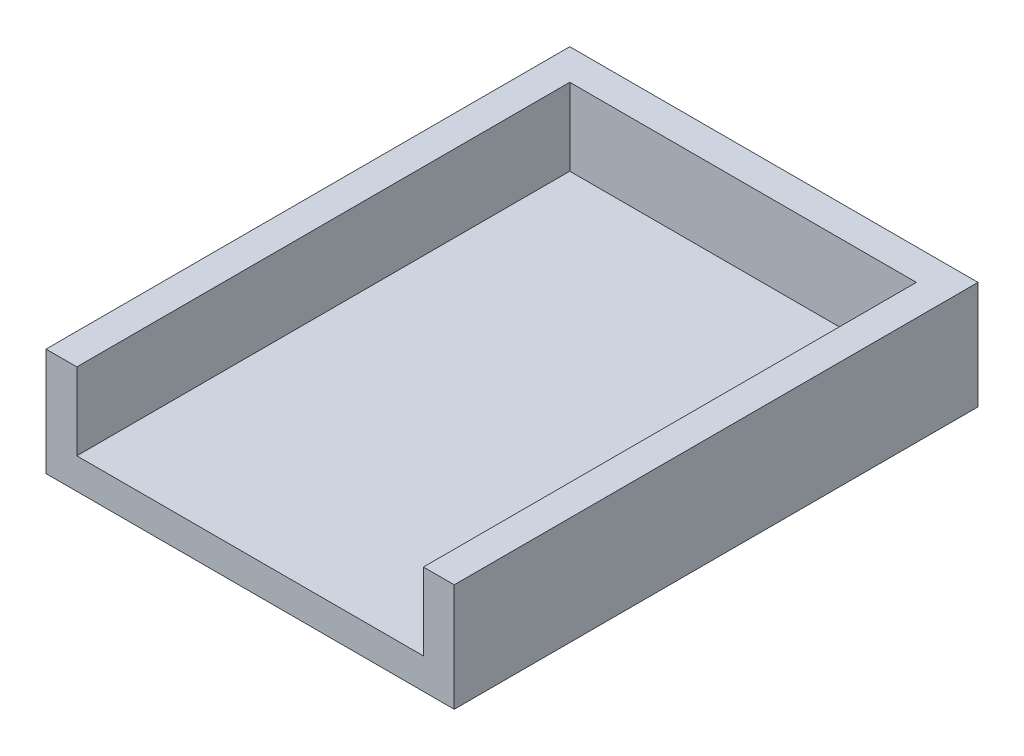
ISO-10303-21;
HEADER;
FILE_DESCRIPTION(('STEP AP214'),'2;1');
FILE_NAME('part.step','',(''),(''),'','','');
FILE_SCHEMA(('AUTOMOTIVE_DESIGN { 1 0 10303 214 1 1 1 1 }'));
ENDSEC;
DATA;
#1=APPLICATION_CONTEXT('core data for automotive mechanical design processes');
#2=APPLICATION_PROTOCOL_DEFINITION('international standard','automotive_design',2000,#1);
#3=PRODUCT_CONTEXT('',#1,'mechanical');
#4=PRODUCT('Part','Part','',(#3));
#5=PRODUCT_RELATED_PRODUCT_CATEGORY('part','',(#4));
#6=PRODUCT_DEFINITION_FORMATION('','',#4);
#7=PRODUCT_DEFINITION_CONTEXT('part definition',#1,'design');
#8=PRODUCT_DEFINITION('design','',#6,#7);
#9=PRODUCT_DEFINITION_SHAPE('','',#8);
#10=(LENGTH_UNIT() NAMED_UNIT(*) SI_UNIT(.MILLI.,.METRE.));
#11=(NAMED_UNIT(*) PLANE_ANGLE_UNIT() SI_UNIT($,.RADIAN.));
#12=(NAMED_UNIT(*) SI_UNIT($,.STERADIAN.) SOLID_ANGLE_UNIT());
#13=UNCERTAINTY_MEASURE_WITH_UNIT(LENGTH_MEASURE(1.E-05),#10,'distance_accuracy_value','');
#14=(GEOMETRIC_REPRESENTATION_CONTEXT(3) GLOBAL_UNCERTAINTY_ASSIGNED_CONTEXT((#13)) GLOBAL_UNIT_ASSIGNED_CONTEXT((#10,
#11,#12)) REPRESENTATION_CONTEXT('',''));
#15=CARTESIAN_POINT('',(0.,0.,0.));
#16=DIRECTION('',(0.,0.,1.));
#17=DIRECTION('',(1.,0.,0.));
#18=AXIS2_PLACEMENT_3D('',#15,#16,#17);
#19=CARTESIAN_POINT('',(-11.25,2.,16.));
#20=DIRECTION('',(0.,0.,-1.));
#21=DIRECTION('',(-1.,0.,0.));
#22=AXIS2_PLACEMENT_3D('',#19,#20,#21);
#23=PLANE('',#22);
#24=DIRECTION('',(1.,0.,0.));
#25=VECTOR('',#24,1.);
#26=CARTESIAN_POINT('',(-11.25,0.,16.));
#27=LINE('',#26,#25);
#28=CARTESIAN_POINT('',(-13.25,0.,16.));
#29=VERTEX_POINT('',#28);
#30=CARTESIAN_POINT('',(13.25,0.,16.));
#31=VERTEX_POINT('',#30);
#32=EDGE_CURVE('E41',#29,#31,#27,.T.);
#33=ORIENTED_EDGE('',*,*,#32,.T.);
#34=DIRECTION('',(0.,-1.,0.));
#35=VECTOR('',#34,1.);
#36=CARTESIAN_POINT('',(13.25,7.,16.));
#37=LINE('',#36,#35);
#38=CARTESIAN_POINT('',(13.25,7.,16.));
#39=VERTEX_POINT('',#38);
#40=EDGE_CURVE('E114',#39,#31,#37,.T.);
#41=ORIENTED_EDGE('',*,*,#40,.F.);
#42=DIRECTION('',(1.,0.,0.));
#43=VECTOR('',#42,1.);
#44=CARTESIAN_POINT('',(0.,7.,16.));
#45=LINE('',#44,#43);
#46=CARTESIAN_POINT('',(11.25,7.,16.));
#47=VERTEX_POINT('',#46);
#48=EDGE_CURVE('E99',#47,#39,#45,.T.);
#49=ORIENTED_EDGE('',*,*,#48,.F.);
#50=DIRECTION('',(0.,-1.,0.));
#51=VECTOR('',#50,1.);
#52=CARTESIAN_POINT('',(11.25,7.,16.));
#53=LINE('',#52,#51);
#54=CARTESIAN_POINT('',(11.25,2.,16.));
#55=VERTEX_POINT('',#54);
#56=EDGE_CURVE('E139',#47,#55,#53,.T.);
#57=ORIENTED_EDGE('',*,*,#56,.T.);
#58=DIRECTION('',(1.,0.,0.));
#59=VECTOR('',#58,1.);
#60=CARTESIAN_POINT('',(-11.25,2.,16.));
#61=LINE('',#60,#59);
#62=CARTESIAN_POINT('',(-11.25,2.,16.));
#63=VERTEX_POINT('',#62);
#64=EDGE_CURVE('E11',#63,#55,#61,.T.);
#65=ORIENTED_EDGE('',*,*,#64,.F.);
#66=DIRECTION('',(0.,-1.,0.));
#67=VECTOR('',#66,1.);
#68=CARTESIAN_POINT('',(-11.25,7.,16.));
#69=LINE('',#68,#67);
#70=CARTESIAN_POINT('',(-11.25,7.,16.));
#71=VERTEX_POINT('',#70);
#72=EDGE_CURVE('E154',#71,#63,#69,.T.);
#73=ORIENTED_EDGE('',*,*,#72,.F.);
#74=DIRECTION('',(-1.,0.,0.));
#75=VECTOR('',#74,1.);
#76=CARTESIAN_POINT('',(0.,7.,16.));
#77=LINE('',#76,#75);
#78=CARTESIAN_POINT('',(-13.25,7.,16.));
#79=VERTEX_POINT('',#78);
#80=EDGE_CURVE('E129',#71,#79,#77,.T.);
#81=ORIENTED_EDGE('',*,*,#80,.T.);
#82=DIRECTION('',(0.,-1.,0.));
#83=VECTOR('',#82,1.);
#84=CARTESIAN_POINT('',(-13.25,7.,16.));
#85=LINE('',#84,#83);
#86=EDGE_CURVE('E157',#79,#29,#85,.T.);
#87=ORIENTED_EDGE('',*,*,#86,.T.);
#88=EDGE_LOOP('',(#33,#41,#49,#57,#65,#73,#81,#87));
#89=FACE_BOUND('',#88,.T.);
#90=ADVANCED_FACE('F38',(#89),#23,.F.);
#91=CARTESIAN_POINT('',(0.,2.,0.));
#92=DIRECTION('',(0.,1.,0.));
#93=DIRECTION('',(0.,0.,1.));
#94=AXIS2_PLACEMENT_3D('',#91,#92,#93);
#95=PLANE('',#94);
#96=DIRECTION('',(0.,0.,-1.));
#97=VECTOR('',#96,1.);
#98=CARTESIAN_POINT('',(11.25,2.,-16.));
#99=LINE('',#98,#97);
#100=CARTESIAN_POINT('',(11.25,2.,-16.));
#101=VERTEX_POINT('',#100);
#102=EDGE_CURVE('E162',#55,#101,#99,.T.);
#103=ORIENTED_EDGE('',*,*,#102,.T.);
#104=DIRECTION('',(-1.,0.,0.));
#105=VECTOR('',#104,1.);
#106=CARTESIAN_POINT('',(-11.25,2.,-16.));
#107=LINE('',#106,#105);
#108=CARTESIAN_POINT('',(-11.25,2.,-16.));
#109=VERTEX_POINT('',#108);
#110=EDGE_CURVE('E164',#101,#109,#107,.T.);
#111=ORIENTED_EDGE('',*,*,#110,.T.);
#112=DIRECTION('',(0.,0.,1.));
#113=VECTOR('',#112,1.);
#114=CARTESIAN_POINT('',(-11.25,2.,-16.));
#115=LINE('',#114,#113);
#116=EDGE_CURVE('E46',#109,#63,#115,.T.);
#117=ORIENTED_EDGE('',*,*,#116,.T.);
#118=ORIENTED_EDGE('',*,*,#64,.T.);
#119=EDGE_LOOP('',(#103,#111,#117,#118));
#120=FACE_BOUND('',#119,.T.);
#121=ADVANCED_FACE('F167',(#120),#95,.T.);
#122=CARTESIAN_POINT('',(0.,0.,0.));
#123=DIRECTION('',(0.,1.,0.));
#124=DIRECTION('',(0.,0.,1.));
#125=AXIS2_PLACEMENT_3D('',#122,#123,#124);
#126=PLANE('',#125);
#127=ORIENTED_EDGE('',*,*,#32,.F.);
#128=DIRECTION('',(0.,0.,-1.));
#129=VECTOR('',#128,1.);
#130=CARTESIAN_POINT('',(-13.25,0.,0.));
#131=LINE('',#130,#129);
#132=CARTESIAN_POINT('',(-13.25,0.,-18.));
#133=VERTEX_POINT('',#132);
#134=EDGE_CURVE('E111',#29,#133,#131,.T.);
#135=ORIENTED_EDGE('',*,*,#134,.T.);
#136=DIRECTION('',(1.,0.,0.));
#137=VECTOR('',#136,1.);
#138=CARTESIAN_POINT('',(0.,0.,-18.));
#139=LINE('',#138,#137);
#140=CARTESIAN_POINT('',(13.25,0.,-18.));
#141=VERTEX_POINT('',#140);
#142=EDGE_CURVE('E142',#133,#141,#139,.T.);
#143=ORIENTED_EDGE('',*,*,#142,.T.);
#144=DIRECTION('',(0.,0.,1.));
#145=VECTOR('',#144,1.);
#146=CARTESIAN_POINT('',(13.25,0.,0.));
#147=LINE('',#146,#145);
#148=EDGE_CURVE('E140',#141,#31,#147,.T.);
#149=ORIENTED_EDGE('',*,*,#148,.T.);
#150=EDGE_LOOP('',(#127,#135,#143,#149));
#151=FACE_BOUND('',#150,.T.);
#152=ADVANCED_FACE('F182',(#151),#126,.F.);
#153=CARTESIAN_POINT('',(13.25,7.,0.));
#154=DIRECTION('',(1.,0.,0.));
#155=DIRECTION('',(0.,0.,-1.));
#156=AXIS2_PLACEMENT_3D('',#153,#154,#155);
#157=PLANE('',#156);
#158=ORIENTED_EDGE('',*,*,#148,.F.);
#159=DIRECTION('',(0.,-1.,0.));
#160=VECTOR('',#159,1.);
#161=CARTESIAN_POINT('',(13.25,7.,-18.));
#162=LINE('',#161,#160);
#163=CARTESIAN_POINT('',(13.25,7.,-18.));
#164=VERTEX_POINT('',#163);
#165=EDGE_CURVE('E119',#164,#141,#162,.T.);
#166=ORIENTED_EDGE('',*,*,#165,.F.);
#167=DIRECTION('',(0.,0.,1.));
#168=VECTOR('',#167,1.);
#169=CARTESIAN_POINT('',(13.25,7.,0.));
#170=LINE('',#169,#168);
#171=EDGE_CURVE('E104',#164,#39,#170,.T.);
#172=ORIENTED_EDGE('',*,*,#171,.T.);
#173=ORIENTED_EDGE('',*,*,#40,.T.);
#174=EDGE_LOOP('',(#158,#166,#172,#173));
#175=FACE_BOUND('',#174,.T.);
#176=ADVANCED_FACE('F121',(#175),#157,.T.);
#177=CARTESIAN_POINT('',(0.,7.,-18.));
#178=DIRECTION('',(0.,0.,-1.));
#179=DIRECTION('',(-1.,0.,0.));
#180=AXIS2_PLACEMENT_3D('',#177,#178,#179);
#181=PLANE('',#180);
#182=ORIENTED_EDGE('',*,*,#142,.F.);
#183=DIRECTION('',(0.,-1.,0.));
#184=VECTOR('',#183,1.);
#185=CARTESIAN_POINT('',(-13.25,7.,-18.));
#186=LINE('',#185,#184);
#187=CARTESIAN_POINT('',(-13.25,7.,-18.));
#188=VERTEX_POINT('',#187);
#189=EDGE_CURVE('E159',#188,#133,#186,.T.);
#190=ORIENTED_EDGE('',*,*,#189,.F.);
#191=DIRECTION('',(1.,0.,0.));
#192=VECTOR('',#191,1.);
#193=CARTESIAN_POINT('',(0.,7.,-18.));
#194=LINE('',#193,#192);
#195=EDGE_CURVE('E122',#188,#164,#194,.T.);
#196=ORIENTED_EDGE('',*,*,#195,.T.);
#197=ORIENTED_EDGE('',*,*,#165,.T.);
#198=EDGE_LOOP('',(#182,#190,#196,#197));
#199=FACE_BOUND('',#198,.T.);
#200=ADVANCED_FACE('F184',(#199),#181,.T.);
#201=CARTESIAN_POINT('',(-13.25,7.,0.));
#202=DIRECTION('',(-1.,0.,0.));
#203=DIRECTION('',(0.,0.,1.));
#204=AXIS2_PLACEMENT_3D('',#201,#202,#203);
#205=PLANE('',#204);
#206=ORIENTED_EDGE('',*,*,#134,.F.);
#207=ORIENTED_EDGE('',*,*,#86,.F.);
#208=DIRECTION('',(0.,0.,-1.));
#209=VECTOR('',#208,1.);
#210=CARTESIAN_POINT('',(-13.25,7.,0.));
#211=LINE('',#210,#209);
#212=EDGE_CURVE('E124',#79,#188,#211,.T.);
#213=ORIENTED_EDGE('',*,*,#212,.T.);
#214=ORIENTED_EDGE('',*,*,#189,.T.);
#215=EDGE_LOOP('',(#206,#207,#213,#214));
#216=FACE_BOUND('',#215,.T.);
#217=ADVANCED_FACE('F179',(#216),#205,.T.);
#218=CARTESIAN_POINT('',(-11.25,7.,0.));
#219=DIRECTION('',(1.,0.,0.));
#220=DIRECTION('',(0.,0.,-1.));
#221=AXIS2_PLACEMENT_3D('',#218,#219,#220);
#222=PLANE('',#221);
#223=ORIENTED_EDGE('',*,*,#72,.T.);
#224=ORIENTED_EDGE('',*,*,#116,.F.);
#225=DIRECTION('',(0.,-1.,0.));
#226=VECTOR('',#225,1.);
#227=CARTESIAN_POINT('',(-11.25,7.,-16.));
#228=LINE('',#227,#226);
#229=CARTESIAN_POINT('',(-11.25,7.,-16.));
#230=VERTEX_POINT('',#229);
#231=EDGE_CURVE('E151',#230,#109,#228,.T.);
#232=ORIENTED_EDGE('',*,*,#231,.F.);
#233=DIRECTION('',(0.,0.,1.));
#234=VECTOR('',#233,1.);
#235=CARTESIAN_POINT('',(-11.25,7.,0.));
#236=LINE('',#235,#234);
#237=EDGE_CURVE('E132',#230,#71,#236,.T.);
#238=ORIENTED_EDGE('',*,*,#237,.T.);
#239=EDGE_LOOP('',(#223,#224,#232,#238));
#240=FACE_BOUND('',#239,.T.);
#241=ADVANCED_FACE('F170',(#240),#222,.T.);
#242=CARTESIAN_POINT('',(0.,7.,-16.));
#243=DIRECTION('',(0.,0.,1.));
#244=DIRECTION('',(1.,0.,0.));
#245=AXIS2_PLACEMENT_3D('',#242,#243,#244);
#246=PLANE('',#245);
#247=ORIENTED_EDGE('',*,*,#231,.T.);
#248=ORIENTED_EDGE('',*,*,#110,.F.);
#249=DIRECTION('',(0.,-1.,0.));
#250=VECTOR('',#249,1.);
#251=CARTESIAN_POINT('',(11.25,7.,-16.));
#252=LINE('',#251,#250);
#253=CARTESIAN_POINT('',(11.25,7.,-16.));
#254=VERTEX_POINT('',#253);
#255=EDGE_CURVE('E148',#254,#101,#252,.T.);
#256=ORIENTED_EDGE('',*,*,#255,.F.);
#257=DIRECTION('',(-1.,0.,0.));
#258=VECTOR('',#257,1.);
#259=CARTESIAN_POINT('',(0.,7.,-16.));
#260=LINE('',#259,#258);
#261=EDGE_CURVE('E135',#254,#230,#260,.T.);
#262=ORIENTED_EDGE('',*,*,#261,.T.);
#263=EDGE_LOOP('',(#247,#248,#256,#262));
#264=FACE_BOUND('',#263,.T.);
#265=ADVANCED_FACE('F172',(#264),#246,.T.);
#266=CARTESIAN_POINT('',(11.25,7.,0.));
#267=DIRECTION('',(-1.,0.,0.));
#268=DIRECTION('',(0.,0.,1.));
#269=AXIS2_PLACEMENT_3D('',#266,#267,#268);
#270=PLANE('',#269);
#271=ORIENTED_EDGE('',*,*,#255,.T.);
#272=ORIENTED_EDGE('',*,*,#102,.F.);
#273=ORIENTED_EDGE('',*,*,#56,.F.);
#274=DIRECTION('',(0.,0.,-1.));
#275=VECTOR('',#274,1.);
#276=CARTESIAN_POINT('',(11.25,7.,0.));
#277=LINE('',#276,#275);
#278=EDGE_CURVE('E108',#47,#254,#277,.T.);
#279=ORIENTED_EDGE('',*,*,#278,.T.);
#280=EDGE_LOOP('',(#271,#272,#273,#279));
#281=FACE_BOUND('',#280,.T.);
#282=ADVANCED_FACE('F175',(#281),#270,.T.);
#283=CARTESIAN_POINT('',(0.,7.,0.));
#284=DIRECTION('',(0.,-1.,0.));
#285=DIRECTION('',(0.,0.,-1.));
#286=AXIS2_PLACEMENT_3D('',#283,#284,#285);
#287=PLANE('',#286);
#288=ORIENTED_EDGE('',*,*,#48,.T.);
#289=ORIENTED_EDGE('',*,*,#171,.F.);
#290=ORIENTED_EDGE('',*,*,#195,.F.);
#291=ORIENTED_EDGE('',*,*,#212,.F.);
#292=ORIENTED_EDGE('',*,*,#80,.F.);
#293=ORIENTED_EDGE('',*,*,#237,.F.);
#294=ORIENTED_EDGE('',*,*,#261,.F.);
#295=ORIENTED_EDGE('',*,*,#278,.F.);
#296=EDGE_LOOP('',(#288,#289,#290,#291,#292,#293,#294,#295));
#297=FACE_BOUND('',#296,.T.);
#298=ADVANCED_FACE('F101',(#297),#287,.F.);
#299=CLOSED_SHELL('',(#90,#121,#152,#176,#200,#217,#241,#265,#282,#298));
#300=MANIFOLD_SOLID_BREP('B2',#299);
#301=ADVANCED_BREP_SHAPE_REPRESENTATION('',(#18,#300),#14);
#302=SHAPE_DEFINITION_REPRESENTATION(#9,#301);
ENDSEC;
END-ISO-10303-21;
